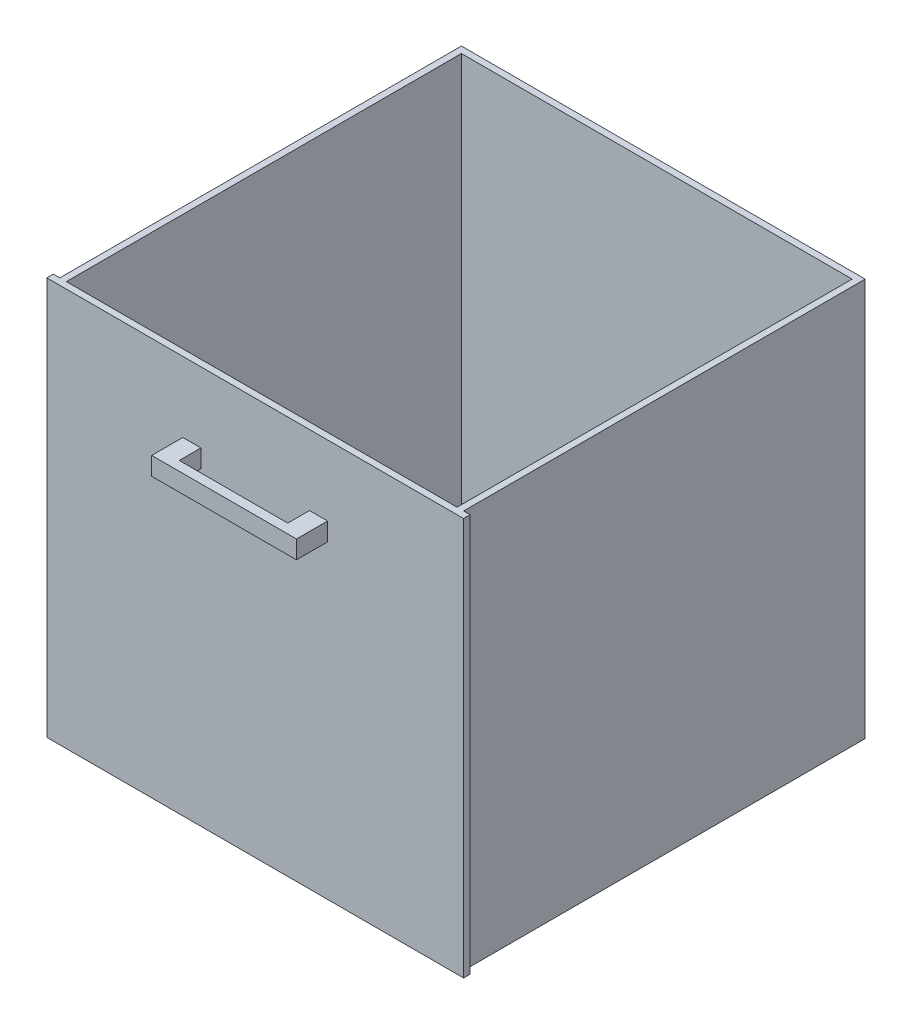
ISO-10303-21;
HEADER;
FILE_DESCRIPTION(('STEP AP214'),'2;1');
FILE_NAME('part.step','',(''),(''),'','','');
FILE_SCHEMA(('AUTOMOTIVE_DESIGN { 1 0 10303 214 1 1 1 1 }'));
ENDSEC;
DATA;
#1=APPLICATION_CONTEXT('core data for automotive mechanical design processes');
#2=APPLICATION_PROTOCOL_DEFINITION('international standard','automotive_design',2000,#1);
#3=PRODUCT_CONTEXT('',#1,'mechanical');
#4=PRODUCT('Part','Part','',(#3));
#5=PRODUCT_RELATED_PRODUCT_CATEGORY('part','',(#4));
#6=PRODUCT_DEFINITION_FORMATION('','',#4);
#7=PRODUCT_DEFINITION_CONTEXT('part definition',#1,'design');
#8=PRODUCT_DEFINITION('design','',#6,#7);
#9=PRODUCT_DEFINITION_SHAPE('','',#8);
#10=(LENGTH_UNIT() NAMED_UNIT(*) SI_UNIT(.MILLI.,.METRE.));
#11=(NAMED_UNIT(*) PLANE_ANGLE_UNIT() SI_UNIT($,.RADIAN.));
#12=(NAMED_UNIT(*) SI_UNIT($,.STERADIAN.) SOLID_ANGLE_UNIT());
#13=UNCERTAINTY_MEASURE_WITH_UNIT(LENGTH_MEASURE(1.E-05),#10,'distance_accuracy_value','');
#14=(GEOMETRIC_REPRESENTATION_CONTEXT(3) GLOBAL_UNCERTAINTY_ASSIGNED_CONTEXT((#13)) GLOBAL_UNIT_ASSIGNED_CONTEXT((#10,
#11,#12)) REPRESENTATION_CONTEXT('',''));
#15=CARTESIAN_POINT('',(0.,0.,0.));
#16=DIRECTION('',(0.,0.,1.));
#17=DIRECTION('',(1.,0.,0.));
#18=AXIS2_PLACEMENT_3D('',#15,#16,#17);
#19=CARTESIAN_POINT('',(193.87900596968,550.,280.280172413793));
#20=DIRECTION('',(0.,0.,-1.));
#21=DIRECTION('',(-1.,0.,0.));
#22=AXIS2_PLACEMENT_3D('',#19,#20,#21);
#23=PLANE('',#22);
#24=DIRECTION('',(0.,1.,0.));
#25=VECTOR('',#24,1.);
#26=CARTESIAN_POINT('',(-19.1209940303198,427.968229793754,280.280172413793));
#27=LINE('',#26,#25);
#28=CARTESIAN_POINT('',(-19.1209940303198,427.968229793754,280.280172413793));
#29=VERTEX_POINT('',#28);
#30=CARTESIAN_POINT('',(-19.1209940303198,452.968229793754,280.280172413793));
#31=VERTEX_POINT('',#30);
#32=EDGE_CURVE('E198',#29,#31,#27,.T.);
#33=ORIENTED_EDGE('',*,*,#32,.T.);
#34=DIRECTION('',(-1.,0.,0.));
#35=VECTOR('',#34,1.);
#36=CARTESIAN_POINT('',(-194.12099403032,452.968229793754,280.280172413793));
#37=LINE('',#36,#35);
#38=CARTESIAN_POINT('',(5.87900596968019,452.968229793754,280.280172413793));
#39=VERTEX_POINT('',#38);
#40=EDGE_CURVE('E214',#39,#31,#37,.T.);
#41=ORIENTED_EDGE('',*,*,#40,.F.);
#42=DIRECTION('',(0.,1.,0.));
#43=VECTOR('',#42,1.);
#44=CARTESIAN_POINT('',(5.87900596968019,452.968229793754,280.280172413793));
#45=LINE('',#44,#43);
#46=CARTESIAN_POINT('',(5.87900596968019,427.968229793754,280.280172413793));
#47=VERTEX_POINT('',#46);
#48=EDGE_CURVE('E197',#47,#39,#45,.T.);
#49=ORIENTED_EDGE('',*,*,#48,.F.);
#50=DIRECTION('',(1.,0.,0.));
#51=VECTOR('',#50,1.);
#52=CARTESIAN_POINT('',(-194.12099403032,427.968229793754,280.280172413793));
#53=LINE('',#52,#51);
#54=EDGE_CURVE('E220',#29,#47,#53,.T.);
#55=ORIENTED_EDGE('',*,*,#54,.F.);
#56=EDGE_LOOP('',(#33,#41,#49,#55));
#57=FACE_BOUND('',#56,.T.);
#58=DIRECTION('',(1.,0.,0.));
#59=VECTOR('',#58,1.);
#60=CARTESIAN_POINT('',(193.87900596968,0.,280.280172413793));
#61=LINE('',#60,#59);
#62=CARTESIAN_POINT('',(-382.12099403032,0.,280.280172413793));
#63=VERTEX_POINT('',#62);
#64=CARTESIAN_POINT('',(193.87900596968,0.,280.280172413793));
#65=VERTEX_POINT('',#64);
#66=EDGE_CURVE('E295',#63,#65,#61,.T.);
#67=ORIENTED_EDGE('',*,*,#66,.T.);
#68=DIRECTION('',(0.,-1.,0.));
#69=VECTOR('',#68,1.);
#70=CARTESIAN_POINT('',(193.87900596968,550.,280.280172413793));
#71=LINE('',#70,#69);
#72=CARTESIAN_POINT('',(193.87900596968,550.,280.280172413793));
#73=VERTEX_POINT('',#72);
#74=EDGE_CURVE('E300',#73,#65,#71,.T.);
#75=ORIENTED_EDGE('',*,*,#74,.F.);
#76=DIRECTION('',(1.,0.,0.));
#77=VECTOR('',#76,1.);
#78=CARTESIAN_POINT('',(193.87900596968,550.,280.280172413793));
#79=LINE('',#78,#77);
#80=CARTESIAN_POINT('',(-382.12099403032,550.,280.280172413793));
#81=VERTEX_POINT('',#80);
#82=EDGE_CURVE('E278',#81,#73,#79,.T.);
#83=ORIENTED_EDGE('',*,*,#82,.F.);
#84=DIRECTION('',(0.,-1.,0.));
#85=VECTOR('',#84,1.);
#86=CARTESIAN_POINT('',(-382.12099403032,550.,280.280172413793));
#87=LINE('',#86,#85);
#88=EDGE_CURVE('E303',#81,#63,#87,.T.);
#89=ORIENTED_EDGE('',*,*,#88,.T.);
#90=EDGE_LOOP('',(#67,#75,#83,#89));
#91=FACE_BOUND('',#90,.T.);
#92=CARTESIAN_POINT('',(-169.12099403032,452.968229793754,280.280172413793));
#93=VERTEX_POINT('',#92);
#94=CARTESIAN_POINT('',(-194.12099403032,452.968229793754,280.280172413793));
#95=VERTEX_POINT('',#94);
#96=EDGE_CURVE('E213',#93,#95,#37,.T.);
#97=ORIENTED_EDGE('',*,*,#96,.F.);
#98=DIRECTION('',(0.,1.,0.));
#99=VECTOR('',#98,1.);
#100=CARTESIAN_POINT('',(-169.12099403032,427.968229793754,280.280172413793));
#101=LINE('',#100,#99);
#102=CARTESIAN_POINT('',(-169.12099403032,427.968229793754,280.280172413793));
#103=VERTEX_POINT('',#102);
#104=EDGE_CURVE('E195',#103,#93,#101,.T.);
#105=ORIENTED_EDGE('',*,*,#104,.F.);
#106=CARTESIAN_POINT('',(-194.12099403032,427.968229793754,280.280172413793));
#107=VERTEX_POINT('',#106);
#108=EDGE_CURVE('E185',#107,#103,#53,.T.);
#109=ORIENTED_EDGE('',*,*,#108,.F.);
#110=DIRECTION('',(0.,-1.,0.));
#111=VECTOR('',#110,1.);
#112=CARTESIAN_POINT('',(-194.12099403032,452.968229793754,280.280172413793));
#113=LINE('',#112,#111);
#114=EDGE_CURVE('E217',#95,#107,#113,.T.);
#115=ORIENTED_EDGE('',*,*,#114,.F.);
#116=EDGE_LOOP('',(#97,#105,#109,#115));
#117=FACE_BOUND('',#116,.T.);
#118=ADVANCED_FACE('F33',(#57,#91,#117),#23,.F.);
#119=CARTESIAN_POINT('',(0.,550.,0.));
#120=DIRECTION('',(0.,-1.,0.));
#121=DIRECTION('',(0.,0.,-1.));
#122=AXIS2_PLACEMENT_3D('',#119,#120,#121);
#123=PLANE('',#122);
#124=DIRECTION('',(-1.,0.,0.));
#125=VECTOR('',#124,1.);
#126=CARTESIAN_POINT('',(184.87900596968,550.,271.280172413793));
#127=LINE('',#126,#125);
#128=CARTESIAN_POINT('',(193.87900596968,550.,271.280172413793));
#129=VERTEX_POINT('',#128);
#130=CARTESIAN_POINT('',(184.87900596968,550.,271.280172413793));
#131=VERTEX_POINT('',#130);
#132=EDGE_CURVE('E264',#129,#131,#127,.T.);
#133=ORIENTED_EDGE('',*,*,#132,.T.);
#134=DIRECTION('',(0.,0.,-1.));
#135=VECTOR('',#134,1.);
#136=CARTESIAN_POINT('',(184.87900596968,550.,-283.719827586207));
#137=LINE('',#136,#135);
#138=CARTESIAN_POINT('',(184.87900596968,550.,-283.719827586207));
#139=VERTEX_POINT('',#138);
#140=EDGE_CURVE('E267',#131,#139,#137,.T.);
#141=ORIENTED_EDGE('',*,*,#140,.T.);
#142=DIRECTION('',(-1.,0.,0.));
#143=VECTOR('',#142,1.);
#144=CARTESIAN_POINT('',(-373.12099403032,550.,-283.719827586207));
#145=LINE('',#144,#143);
#146=CARTESIAN_POINT('',(-373.12099403032,550.,-283.719827586207));
#147=VERTEX_POINT('',#146);
#148=EDGE_CURVE('E270',#139,#147,#145,.T.);
#149=ORIENTED_EDGE('',*,*,#148,.T.);
#150=DIRECTION('',(0.,0.,1.));
#151=VECTOR('',#150,1.);
#152=CARTESIAN_POINT('',(-373.12099403032,550.,-283.719827586207));
#153=LINE('',#152,#151);
#154=CARTESIAN_POINT('',(-373.12099403032,550.,271.280172413793));
#155=VERTEX_POINT('',#154);
#156=EDGE_CURVE('E272',#147,#155,#153,.T.);
#157=ORIENTED_EDGE('',*,*,#156,.T.);
#158=DIRECTION('',(-1.,0.,0.));
#159=VECTOR('',#158,1.);
#160=CARTESIAN_POINT('',(-382.12099403032,550.,271.280172413793));
#161=LINE('',#160,#159);
#162=CARTESIAN_POINT('',(-382.12099403032,550.,271.280172413793));
#163=VERTEX_POINT('',#162);
#164=EDGE_CURVE('E274',#155,#163,#161,.T.);
#165=ORIENTED_EDGE('',*,*,#164,.T.);
#166=DIRECTION('',(0.,0.,1.));
#167=VECTOR('',#166,1.);
#168=CARTESIAN_POINT('',(-382.12099403032,550.,280.280172413793));
#169=LINE('',#168,#167);
#170=EDGE_CURVE('E276',#163,#81,#169,.T.);
#171=ORIENTED_EDGE('',*,*,#170,.T.);
#172=ORIENTED_EDGE('',*,*,#82,.T.);
#173=DIRECTION('',(0.,0.,-1.));
#174=VECTOR('',#173,1.);
#175=CARTESIAN_POINT('',(193.87900596968,550.,271.280172413793));
#176=LINE('',#175,#174);
#177=EDGE_CURVE('E280',#73,#129,#176,.T.);
#178=ORIENTED_EDGE('',*,*,#177,.T.);
#179=EDGE_LOOP('',(#133,#141,#149,#157,#165,#171,#172,#178));
#180=FACE_BOUND('',#179,.T.);
#181=DIRECTION('',(0.,0.,1.));
#182=VECTOR('',#181,1.);
#183=CARTESIAN_POINT('',(175.87900596968,550.,0.));
#184=LINE('',#183,#182);
#185=CARTESIAN_POINT('',(175.87900596968,550.,-274.719827586207));
#186=VERTEX_POINT('',#185);
#187=CARTESIAN_POINT('',(175.87900596968,550.,271.280172413793));
#188=VERTEX_POINT('',#187);
#189=EDGE_CURVE('E232',#186,#188,#184,.T.);
#190=ORIENTED_EDGE('',*,*,#189,.T.);
#191=DIRECTION('',(1.,0.,0.));
#192=VECTOR('',#191,1.);
#193=CARTESIAN_POINT('',(0.,550.,271.280172413793));
#194=LINE('',#193,#192);
#195=CARTESIAN_POINT('',(-364.12099403032,550.,271.280172413793));
#196=VERTEX_POINT('',#195);
#197=EDGE_CURVE('E236',#196,#188,#194,.T.);
#198=ORIENTED_EDGE('',*,*,#197,.F.);
#199=DIRECTION('',(0.,0.,1.));
#200=VECTOR('',#199,1.);
#201=CARTESIAN_POINT('',(-364.12099403032,550.,0.));
#202=LINE('',#201,#200);
#203=CARTESIAN_POINT('',(-364.12099403032,550.,-274.719827586207));
#204=VERTEX_POINT('',#203);
#205=EDGE_CURVE('E250',#204,#196,#202,.T.);
#206=ORIENTED_EDGE('',*,*,#205,.F.);
#207=DIRECTION('',(1.,0.,0.));
#208=VECTOR('',#207,1.);
#209=CARTESIAN_POINT('',(0.,550.,-274.719827586207));
#210=LINE('',#209,#208);
#211=EDGE_CURVE('E247',#204,#186,#210,.T.);
#212=ORIENTED_EDGE('',*,*,#211,.T.);
#213=EDGE_LOOP('',(#190,#198,#206,#212));
#214=FACE_BOUND('',#213,.T.);
#215=ADVANCED_FACE('F338',(#180,#214),#123,.F.);
#216=CARTESIAN_POINT('',(184.87900596968,550.,271.280172413793));
#217=DIRECTION('',(0.,0.,1.));
#218=DIRECTION('',(1.,0.,0.));
#219=AXIS2_PLACEMENT_3D('',#216,#217,#218);
#220=PLANE('',#219);
#221=DIRECTION('',(-1.,0.,0.));
#222=VECTOR('',#221,1.);
#223=CARTESIAN_POINT('',(184.87900596968,0.,271.280172413793));
#224=LINE('',#223,#222);
#225=CARTESIAN_POINT('',(193.87900596968,0.,271.280172413793));
#226=VERTEX_POINT('',#225);
#227=CARTESIAN_POINT('',(184.87900596968,0.,271.280172413793));
#228=VERTEX_POINT('',#227);
#229=EDGE_CURVE('E257',#226,#228,#224,.T.);
#230=ORIENTED_EDGE('',*,*,#229,.T.);
#231=DIRECTION('',(0.,-1.,0.));
#232=VECTOR('',#231,1.);
#233=CARTESIAN_POINT('',(184.87900596968,550.,271.280172413793));
#234=LINE('',#233,#232);
#235=EDGE_CURVE('E11',#131,#228,#234,.T.);
#236=ORIENTED_EDGE('',*,*,#235,.F.);
#237=ORIENTED_EDGE('',*,*,#132,.F.);
#238=DIRECTION('',(0.,-1.,0.));
#239=VECTOR('',#238,1.);
#240=CARTESIAN_POINT('',(193.87900596968,550.,271.280172413793));
#241=LINE('',#240,#239);
#242=EDGE_CURVE('E282',#129,#226,#241,.T.);
#243=ORIENTED_EDGE('',*,*,#242,.T.);
#244=EDGE_LOOP('',(#230,#236,#237,#243));
#245=FACE_BOUND('',#244,.T.);
#246=ADVANCED_FACE('F35',(#245),#220,.F.);
#247=CARTESIAN_POINT('',(184.87900596968,550.,-283.719827586207));
#248=DIRECTION('',(-1.,0.,0.));
#249=DIRECTION('',(0.,0.,1.));
#250=AXIS2_PLACEMENT_3D('',#247,#248,#249);
#251=PLANE('',#250);
#252=DIRECTION('',(0.,0.,-1.));
#253=VECTOR('',#252,1.);
#254=CARTESIAN_POINT('',(184.87900596968,0.,-283.719827586207));
#255=LINE('',#254,#253);
#256=CARTESIAN_POINT('',(184.87900596968,0.,-283.719827586207));
#257=VERTEX_POINT('',#256);
#258=EDGE_CURVE('E285',#228,#257,#255,.T.);
#259=ORIENTED_EDGE('',*,*,#258,.T.);
#260=DIRECTION('',(0.,-1.,0.));
#261=VECTOR('',#260,1.);
#262=CARTESIAN_POINT('',(184.87900596968,550.,-283.719827586207));
#263=LINE('',#262,#261);
#264=EDGE_CURVE('E41',#139,#257,#263,.T.);
#265=ORIENTED_EDGE('',*,*,#264,.F.);
#266=ORIENTED_EDGE('',*,*,#140,.F.);
#267=ORIENTED_EDGE('',*,*,#235,.T.);
#268=EDGE_LOOP('',(#259,#265,#266,#267));
#269=FACE_BOUND('',#268,.T.);
#270=ADVANCED_FACE('F343',(#269),#251,.F.);
#271=CARTESIAN_POINT('',(-373.12099403032,550.,-283.719827586207));
#272=DIRECTION('',(0.,0.,1.));
#273=DIRECTION('',(1.,0.,0.));
#274=AXIS2_PLACEMENT_3D('',#271,#272,#273);
#275=PLANE('',#274);
#276=DIRECTION('',(-1.,0.,0.));
#277=VECTOR('',#276,1.);
#278=CARTESIAN_POINT('',(-373.12099403032,0.,-283.719827586207));
#279=LINE('',#278,#277);
#280=CARTESIAN_POINT('',(-373.12099403032,0.,-283.719827586207));
#281=VERTEX_POINT('',#280);
#282=EDGE_CURVE('E287',#257,#281,#279,.T.);
#283=ORIENTED_EDGE('',*,*,#282,.T.);
#284=DIRECTION('',(0.,-1.,0.));
#285=VECTOR('',#284,1.);
#286=CARTESIAN_POINT('',(-373.12099403032,550.,-283.719827586207));
#287=LINE('',#286,#285);
#288=EDGE_CURVE('E312',#147,#281,#287,.T.);
#289=ORIENTED_EDGE('',*,*,#288,.F.);
#290=ORIENTED_EDGE('',*,*,#148,.F.);
#291=ORIENTED_EDGE('',*,*,#264,.T.);
#292=EDGE_LOOP('',(#283,#289,#290,#291));
#293=FACE_BOUND('',#292,.T.);
#294=ADVANCED_FACE('F319',(#293),#275,.F.);
#295=CARTESIAN_POINT('',(-373.12099403032,550.,-283.719827586207));
#296=DIRECTION('',(1.,0.,0.));
#297=DIRECTION('',(0.,0.,-1.));
#298=AXIS2_PLACEMENT_3D('',#295,#296,#297);
#299=PLANE('',#298);
#300=DIRECTION('',(0.,0.,1.));
#301=VECTOR('',#300,1.);
#302=CARTESIAN_POINT('',(-373.12099403032,0.,-283.719827586207));
#303=LINE('',#302,#301);
#304=CARTESIAN_POINT('',(-373.12099403032,0.,271.280172413793));
#305=VERTEX_POINT('',#304);
#306=EDGE_CURVE('E289',#281,#305,#303,.T.);
#307=ORIENTED_EDGE('',*,*,#306,.T.);
#308=DIRECTION('',(0.,-1.,0.));
#309=VECTOR('',#308,1.);
#310=CARTESIAN_POINT('',(-373.12099403032,550.,271.280172413793));
#311=LINE('',#310,#309);
#312=EDGE_CURVE('E309',#155,#305,#311,.T.);
#313=ORIENTED_EDGE('',*,*,#312,.F.);
#314=ORIENTED_EDGE('',*,*,#156,.F.);
#315=ORIENTED_EDGE('',*,*,#288,.T.);
#316=EDGE_LOOP('',(#307,#313,#314,#315));
#317=FACE_BOUND('',#316,.T.);
#318=ADVANCED_FACE('F330',(#317),#299,.F.);
#319=CARTESIAN_POINT('',(-382.12099403032,550.,271.280172413793));
#320=DIRECTION('',(0.,0.,1.));
#321=DIRECTION('',(1.,0.,0.));
#322=AXIS2_PLACEMENT_3D('',#319,#320,#321);
#323=PLANE('',#322);
#324=DIRECTION('',(-1.,0.,0.));
#325=VECTOR('',#324,1.);
#326=CARTESIAN_POINT('',(-382.12099403032,0.,271.280172413793));
#327=LINE('',#326,#325);
#328=CARTESIAN_POINT('',(-382.12099403032,0.,271.280172413793));
#329=VERTEX_POINT('',#328);
#330=EDGE_CURVE('E291',#305,#329,#327,.T.);
#331=ORIENTED_EDGE('',*,*,#330,.T.);
#332=DIRECTION('',(0.,-1.,0.));
#333=VECTOR('',#332,1.);
#334=CARTESIAN_POINT('',(-382.12099403032,550.,271.280172413793));
#335=LINE('',#334,#333);
#336=EDGE_CURVE('E306',#163,#329,#335,.T.);
#337=ORIENTED_EDGE('',*,*,#336,.F.);
#338=ORIENTED_EDGE('',*,*,#164,.F.);
#339=ORIENTED_EDGE('',*,*,#312,.T.);
#340=EDGE_LOOP('',(#331,#337,#338,#339));
#341=FACE_BOUND('',#340,.T.);
#342=ADVANCED_FACE('F334',(#341),#323,.F.);
#343=CARTESIAN_POINT('',(-382.12099403032,550.,280.280172413793));
#344=DIRECTION('',(1.,0.,0.));
#345=DIRECTION('',(0.,0.,-1.));
#346=AXIS2_PLACEMENT_3D('',#343,#344,#345);
#347=PLANE('',#346);
#348=DIRECTION('',(0.,0.,1.));
#349=VECTOR('',#348,1.);
#350=CARTESIAN_POINT('',(-382.12099403032,0.,280.280172413793));
#351=LINE('',#350,#349);
#352=EDGE_CURVE('E293',#329,#63,#351,.T.);
#353=ORIENTED_EDGE('',*,*,#352,.T.);
#354=ORIENTED_EDGE('',*,*,#88,.F.);
#355=ORIENTED_EDGE('',*,*,#170,.F.);
#356=ORIENTED_EDGE('',*,*,#336,.T.);
#357=EDGE_LOOP('',(#353,#354,#355,#356));
#358=FACE_BOUND('',#357,.T.);
#359=ADVANCED_FACE('F356',(#358),#347,.F.);
#360=CARTESIAN_POINT('',(193.87900596968,550.,271.280172413793));
#361=DIRECTION('',(-1.,0.,0.));
#362=DIRECTION('',(0.,0.,1.));
#363=AXIS2_PLACEMENT_3D('',#360,#361,#362);
#364=PLANE('',#363);
#365=DIRECTION('',(0.,0.,-1.));
#366=VECTOR('',#365,1.);
#367=CARTESIAN_POINT('',(193.87900596968,0.,271.280172413793));
#368=LINE('',#367,#366);
#369=EDGE_CURVE('E268',#65,#226,#368,.T.);
#370=ORIENTED_EDGE('',*,*,#369,.T.);
#371=ORIENTED_EDGE('',*,*,#242,.F.);
#372=ORIENTED_EDGE('',*,*,#177,.F.);
#373=ORIENTED_EDGE('',*,*,#74,.T.);
#374=EDGE_LOOP('',(#370,#371,#372,#373));
#375=FACE_BOUND('',#374,.T.);
#376=ADVANCED_FACE('F349',(#375),#364,.F.);
#377=CARTESIAN_POINT('',(0.,0.,0.));
#378=DIRECTION('',(0.,-1.,0.));
#379=DIRECTION('',(0.,0.,-1.));
#380=AXIS2_PLACEMENT_3D('',#377,#378,#379);
#381=PLANE('',#380);
#382=ORIENTED_EDGE('',*,*,#229,.F.);
#383=ORIENTED_EDGE('',*,*,#369,.F.);
#384=ORIENTED_EDGE('',*,*,#66,.F.);
#385=ORIENTED_EDGE('',*,*,#352,.F.);
#386=ORIENTED_EDGE('',*,*,#330,.F.);
#387=ORIENTED_EDGE('',*,*,#306,.F.);
#388=ORIENTED_EDGE('',*,*,#282,.F.);
#389=ORIENTED_EDGE('',*,*,#258,.F.);
#390=EDGE_LOOP('',(#382,#383,#384,#385,#386,#387,#388,#389));
#391=FACE_BOUND('',#390,.T.);
#392=ADVANCED_FACE('F325',(#391),#381,.T.);
#393=CARTESIAN_POINT('',(175.87900596968,5.,0.));
#394=DIRECTION('',(-1.,0.,0.));
#395=DIRECTION('',(0.,0.,1.));
#396=AXIS2_PLACEMENT_3D('',#393,#394,#395);
#397=PLANE('',#396);
#398=ORIENTED_EDGE('',*,*,#189,.F.);
#399=DIRECTION('',(0.,1.,0.));
#400=VECTOR('',#399,1.);
#401=CARTESIAN_POINT('',(175.87900596968,5.,-274.719827586207));
#402=LINE('',#401,#400);
#403=CARTESIAN_POINT('',(175.87900596968,5.,-274.719827586207));
#404=VERTEX_POINT('',#403);
#405=EDGE_CURVE('E244',#404,#186,#402,.T.);
#406=ORIENTED_EDGE('',*,*,#405,.F.);
#407=DIRECTION('',(0.,0.,1.));
#408=VECTOR('',#407,1.);
#409=CARTESIAN_POINT('',(175.87900596968,5.,0.));
#410=LINE('',#409,#408);
#411=CARTESIAN_POINT('',(175.87900596968,5.,271.280172413793));
#412=VERTEX_POINT('',#411);
#413=EDGE_CURVE('E233',#404,#412,#410,.T.);
#414=ORIENTED_EDGE('',*,*,#413,.T.);
#415=DIRECTION('',(0.,1.,0.));
#416=VECTOR('',#415,1.);
#417=CARTESIAN_POINT('',(175.87900596968,5.,271.280172413793));
#418=LINE('',#417,#416);
#419=EDGE_CURVE('E255',#412,#188,#418,.T.);
#420=ORIENTED_EDGE('',*,*,#419,.T.);
#421=EDGE_LOOP('',(#398,#406,#414,#420));
#422=FACE_BOUND('',#421,.T.);
#423=ADVANCED_FACE('F374',(#422),#397,.T.);
#424=CARTESIAN_POINT('',(0.,5.,271.280172413793));
#425=DIRECTION('',(0.,0.,1.));
#426=DIRECTION('',(1.,0.,0.));
#427=AXIS2_PLACEMENT_3D('',#424,#425,#426);
#428=PLANE('',#427);
#429=ORIENTED_EDGE('',*,*,#197,.T.);
#430=ORIENTED_EDGE('',*,*,#419,.F.);
#431=DIRECTION('',(1.,0.,0.));
#432=VECTOR('',#431,1.);
#433=CARTESIAN_POINT('',(0.,5.,271.280172413793));
#434=LINE('',#433,#432);
#435=CARTESIAN_POINT('',(-364.12099403032,5.,271.280172413793));
#436=VERTEX_POINT('',#435);
#437=EDGE_CURVE('E241',#436,#412,#434,.T.);
#438=ORIENTED_EDGE('',*,*,#437,.F.);
#439=DIRECTION('',(0.,1.,0.));
#440=VECTOR('',#439,1.);
#441=CARTESIAN_POINT('',(-364.12099403032,5.,271.280172413793));
#442=LINE('',#441,#440);
#443=EDGE_CURVE('E258',#436,#196,#442,.T.);
#444=ORIENTED_EDGE('',*,*,#443,.T.);
#445=EDGE_LOOP('',(#429,#430,#438,#444));
#446=FACE_BOUND('',#445,.T.);
#447=ADVANCED_FACE('F378',(#446),#428,.F.);
#448=CARTESIAN_POINT('',(-364.12099403032,5.,0.));
#449=DIRECTION('',(-1.,0.,0.));
#450=DIRECTION('',(0.,0.,1.));
#451=AXIS2_PLACEMENT_3D('',#448,#449,#450);
#452=PLANE('',#451);
#453=ORIENTED_EDGE('',*,*,#205,.T.);
#454=ORIENTED_EDGE('',*,*,#443,.F.);
#455=DIRECTION('',(0.,0.,1.));
#456=VECTOR('',#455,1.);
#457=CARTESIAN_POINT('',(-364.12099403032,5.,0.));
#458=LINE('',#457,#456);
#459=CARTESIAN_POINT('',(-364.12099403032,5.,-274.719827586207));
#460=VERTEX_POINT('',#459);
#461=EDGE_CURVE('E238',#460,#436,#458,.T.);
#462=ORIENTED_EDGE('',*,*,#461,.F.);
#463=DIRECTION('',(0.,1.,0.));
#464=VECTOR('',#463,1.);
#465=CARTESIAN_POINT('',(-364.12099403032,5.,-274.719827586207));
#466=LINE('',#465,#464);
#467=EDGE_CURVE('E260',#460,#204,#466,.T.);
#468=ORIENTED_EDGE('',*,*,#467,.T.);
#469=EDGE_LOOP('',(#453,#454,#462,#468));
#470=FACE_BOUND('',#469,.T.);
#471=ADVANCED_FACE('F384',(#470),#452,.F.);
#472=CARTESIAN_POINT('',(0.,5.,-274.719827586207));
#473=DIRECTION('',(0.,0.,1.));
#474=DIRECTION('',(1.,0.,0.));
#475=AXIS2_PLACEMENT_3D('',#472,#473,#474);
#476=PLANE('',#475);
#477=ORIENTED_EDGE('',*,*,#211,.F.);
#478=ORIENTED_EDGE('',*,*,#467,.F.);
#479=DIRECTION('',(1.,0.,0.));
#480=VECTOR('',#479,1.);
#481=CARTESIAN_POINT('',(0.,5.,-274.719827586207));
#482=LINE('',#481,#480);
#483=EDGE_CURVE('E235',#460,#404,#482,.T.);
#484=ORIENTED_EDGE('',*,*,#483,.T.);
#485=ORIENTED_EDGE('',*,*,#405,.T.);
#486=EDGE_LOOP('',(#477,#478,#484,#485));
#487=FACE_BOUND('',#486,.T.);
#488=ADVANCED_FACE('F380',(#487),#476,.T.);
#489=CARTESIAN_POINT('',(0.,5.,0.));
#490=DIRECTION('',(0.,1.,0.));
#491=DIRECTION('',(0.,0.,1.));
#492=AXIS2_PLACEMENT_3D('',#489,#490,#491);
#493=PLANE('',#492);
#494=ORIENTED_EDGE('',*,*,#413,.F.);
#495=ORIENTED_EDGE('',*,*,#483,.F.);
#496=ORIENTED_EDGE('',*,*,#461,.T.);
#497=ORIENTED_EDGE('',*,*,#437,.T.);
#498=EDGE_LOOP('',(#494,#495,#496,#497));
#499=FACE_BOUND('',#498,.T.);
#500=ADVANCED_FACE('F383',(#499),#493,.T.);
#501=CARTESIAN_POINT('',(5.87900596968019,452.968229793754,323.280172413793));
#502=DIRECTION('',(-1.,0.,0.));
#503=DIRECTION('',(0.,-1.,0.));
#504=AXIS2_PLACEMENT_3D('',#501,#502,#503);
#505=PLANE('',#504);
#506=ORIENTED_EDGE('',*,*,#48,.T.);
#507=DIRECTION('',(0.,0.,-1.));
#508=VECTOR('',#507,1.);
#509=CARTESIAN_POINT('',(5.87900596968019,452.968229793754,323.280172413793));
#510=LINE('',#509,#508);
#511=CARTESIAN_POINT('',(5.87900596968019,452.968229793754,323.280172413793));
#512=VERTEX_POINT('',#511);
#513=EDGE_CURVE('E229',#512,#39,#510,.T.);
#514=ORIENTED_EDGE('',*,*,#513,.F.);
#515=DIRECTION('',(0.,1.,0.));
#516=VECTOR('',#515,1.);
#517=CARTESIAN_POINT('',(5.87900596968019,452.968229793754,323.280172413793));
#518=LINE('',#517,#516);
#519=CARTESIAN_POINT('',(5.87900596968019,427.968229793754,323.280172413793));
#520=VERTEX_POINT('',#519);
#521=EDGE_CURVE('E201',#520,#512,#518,.T.);
#522=ORIENTED_EDGE('',*,*,#521,.F.);
#523=DIRECTION('',(0.,0.,-1.));
#524=VECTOR('',#523,1.);
#525=CARTESIAN_POINT('',(5.87900596968019,427.968229793754,323.280172413793));
#526=LINE('',#525,#524);
#527=EDGE_CURVE('E210',#520,#47,#526,.T.);
#528=ORIENTED_EDGE('',*,*,#527,.T.);
#529=EDGE_LOOP('',(#506,#514,#522,#528));
#530=FACE_BOUND('',#529,.T.);
#531=ADVANCED_FACE('F394',(#530),#505,.F.);
#532=CARTESIAN_POINT('',(-194.12099403032,452.968229793754,323.280172413793));
#533=DIRECTION('',(0.,-1.,0.));
#534=DIRECTION('',(0.,0.,-1.));
#535=AXIS2_PLACEMENT_3D('',#532,#533,#534);
#536=PLANE('',#535);
#537=DIRECTION('',(1.,0.,0.));
#538=VECTOR('',#537,1.);
#539=CARTESIAN_POINT('',(-169.12099403032,452.968229793754,310.280172413793));
#540=LINE('',#539,#538);
#541=CARTESIAN_POINT('',(-169.12099403032,452.968229793754,310.280172413793));
#542=VERTEX_POINT('',#541);
#543=CARTESIAN_POINT('',(-19.1209940303198,452.968229793754,310.280172413793));
#544=VERTEX_POINT('',#543);
#545=EDGE_CURVE('E189',#542,#544,#540,.T.);
#546=ORIENTED_EDGE('',*,*,#545,.F.);
#547=DIRECTION('',(0.,0.,1.));
#548=VECTOR('',#547,1.);
#549=CARTESIAN_POINT('',(-169.12099403032,452.968229793754,280.280172413793));
#550=LINE('',#549,#548);
#551=EDGE_CURVE('E48',#93,#542,#550,.T.);
#552=ORIENTED_EDGE('',*,*,#551,.F.);
#553=ORIENTED_EDGE('',*,*,#96,.T.);
#554=DIRECTION('',(0.,0.,-1.));
#555=VECTOR('',#554,1.);
#556=CARTESIAN_POINT('',(-194.12099403032,452.968229793754,323.280172413793));
#557=LINE('',#556,#555);
#558=CARTESIAN_POINT('',(-194.12099403032,452.968229793754,323.280172413793));
#559=VERTEX_POINT('',#558);
#560=EDGE_CURVE('E226',#559,#95,#557,.T.);
#561=ORIENTED_EDGE('',*,*,#560,.F.);
#562=DIRECTION('',(-1.,0.,0.));
#563=VECTOR('',#562,1.);
#564=CARTESIAN_POINT('',(-194.12099403032,452.968229793754,323.280172413793));
#565=LINE('',#564,#563);
#566=EDGE_CURVE('E204',#512,#559,#565,.T.);
#567=ORIENTED_EDGE('',*,*,#566,.F.);
#568=ORIENTED_EDGE('',*,*,#513,.T.);
#569=ORIENTED_EDGE('',*,*,#40,.T.);
#570=DIRECTION('',(0.,0.,1.));
#571=VECTOR('',#570,1.);
#572=CARTESIAN_POINT('',(-19.1209940303198,452.968229793754,280.280172413793));
#573=LINE('',#572,#571);
#574=EDGE_CURVE('E186',#31,#544,#573,.T.);
#575=ORIENTED_EDGE('',*,*,#574,.T.);
#576=EDGE_LOOP('',(#546,#552,#553,#561,#567,#568,#569,#575));
#577=FACE_BOUND('',#576,.T.);
#578=ADVANCED_FACE('F398',(#577),#536,.F.);
#579=CARTESIAN_POINT('',(-194.12099403032,452.968229793754,323.280172413793));
#580=DIRECTION('',(1.,0.,0.));
#581=DIRECTION('',(0.,1.,0.));
#582=AXIS2_PLACEMENT_3D('',#579,#580,#581);
#583=PLANE('',#582);
#584=ORIENTED_EDGE('',*,*,#114,.T.);
#585=DIRECTION('',(0.,0.,-1.));
#586=VECTOR('',#585,1.);
#587=CARTESIAN_POINT('',(-194.12099403032,427.968229793754,323.280172413793));
#588=LINE('',#587,#586);
#589=CARTESIAN_POINT('',(-194.12099403032,427.968229793754,323.280172413793));
#590=VERTEX_POINT('',#589);
#591=EDGE_CURVE('E224',#590,#107,#588,.T.);
#592=ORIENTED_EDGE('',*,*,#591,.F.);
#593=DIRECTION('',(0.,-1.,0.));
#594=VECTOR('',#593,1.);
#595=CARTESIAN_POINT('',(-194.12099403032,452.968229793754,323.280172413793));
#596=LINE('',#595,#594);
#597=EDGE_CURVE('E206',#559,#590,#596,.T.);
#598=ORIENTED_EDGE('',*,*,#597,.F.);
#599=ORIENTED_EDGE('',*,*,#560,.T.);
#600=EDGE_LOOP('',(#584,#592,#598,#599));
#601=FACE_BOUND('',#600,.T.);
#602=ADVANCED_FACE('F402',(#601),#583,.F.);
#603=CARTESIAN_POINT('',(-194.12099403032,427.968229793754,323.280172413793));
#604=DIRECTION('',(0.,1.,0.));
#605=DIRECTION('',(0.,0.,1.));
#606=AXIS2_PLACEMENT_3D('',#603,#604,#605);
#607=PLANE('',#606);
#608=ORIENTED_EDGE('',*,*,#108,.T.);
#609=DIRECTION('',(0.,0.,1.));
#610=VECTOR('',#609,1.);
#611=CARTESIAN_POINT('',(-169.12099403032,427.968229793754,280.280172413793));
#612=LINE('',#611,#610);
#613=CARTESIAN_POINT('',(-169.12099403032,427.968229793754,310.280172413793));
#614=VERTEX_POINT('',#613);
#615=EDGE_CURVE('E172',#103,#614,#612,.T.);
#616=ORIENTED_EDGE('',*,*,#615,.T.);
#617=DIRECTION('',(1.,0.,0.));
#618=VECTOR('',#617,1.);
#619=CARTESIAN_POINT('',(-169.12099403032,427.968229793754,310.280172413793));
#620=LINE('',#619,#618);
#621=CARTESIAN_POINT('',(-19.1209940303198,427.968229793754,310.280172413793));
#622=VERTEX_POINT('',#621);
#623=EDGE_CURVE('E178',#614,#622,#620,.T.);
#624=ORIENTED_EDGE('',*,*,#623,.T.);
#625=DIRECTION('',(0.,0.,1.));
#626=VECTOR('',#625,1.);
#627=CARTESIAN_POINT('',(-19.1209940303198,427.968229793754,280.280172413793));
#628=LINE('',#627,#626);
#629=EDGE_CURVE('E175',#29,#622,#628,.T.);
#630=ORIENTED_EDGE('',*,*,#629,.F.);
#631=ORIENTED_EDGE('',*,*,#54,.T.);
#632=ORIENTED_EDGE('',*,*,#527,.F.);
#633=DIRECTION('',(1.,0.,0.));
#634=VECTOR('',#633,1.);
#635=CARTESIAN_POINT('',(-194.12099403032,427.968229793754,323.280172413793));
#636=LINE('',#635,#634);
#637=EDGE_CURVE('E208',#590,#520,#636,.T.);
#638=ORIENTED_EDGE('',*,*,#637,.F.);
#639=ORIENTED_EDGE('',*,*,#591,.T.);
#640=EDGE_LOOP('',(#608,#616,#624,#630,#631,#632,#638,#639));
#641=FACE_BOUND('',#640,.T.);
#642=ADVANCED_FACE('F183',(#641),#607,.F.);
#643=CARTESIAN_POINT('',(0.,0.,323.280172413793));
#644=DIRECTION('',(0.,0.,1.));
#645=DIRECTION('',(1.,0.,0.));
#646=AXIS2_PLACEMENT_3D('',#643,#644,#645);
#647=PLANE('',#646);
#648=ORIENTED_EDGE('',*,*,#521,.T.);
#649=ORIENTED_EDGE('',*,*,#566,.T.);
#650=ORIENTED_EDGE('',*,*,#597,.T.);
#651=ORIENTED_EDGE('',*,*,#637,.T.);
#652=EDGE_LOOP('',(#648,#649,#650,#651));
#653=FACE_BOUND('',#652,.T.);
#654=ADVANCED_FACE('F409',(#653),#647,.T.);
#655=CARTESIAN_POINT('',(-169.12099403032,427.968229793754,280.280172413793));
#656=DIRECTION('',(-1.,0.,0.));
#657=DIRECTION('',(0.,0.,1.));
#658=AXIS2_PLACEMENT_3D('',#655,#656,#657);
#659=PLANE('',#658);
#660=ORIENTED_EDGE('',*,*,#551,.T.);
#661=DIRECTION('',(0.,1.,0.));
#662=VECTOR('',#661,1.);
#663=CARTESIAN_POINT('',(-169.12099403032,427.968229793754,310.280172413793));
#664=LINE('',#663,#662);
#665=EDGE_CURVE('E169',#614,#542,#664,.T.);
#666=ORIENTED_EDGE('',*,*,#665,.F.);
#667=ORIENTED_EDGE('',*,*,#615,.F.);
#668=ORIENTED_EDGE('',*,*,#104,.T.);
#669=EDGE_LOOP('',(#660,#666,#667,#668));
#670=FACE_BOUND('',#669,.T.);
#671=ADVANCED_FACE('F170',(#670),#659,.F.);
#672=CARTESIAN_POINT('',(-19.1209940303198,427.968229793754,280.280172413793));
#673=DIRECTION('',(-1.,0.,0.));
#674=DIRECTION('',(0.,0.,1.));
#675=AXIS2_PLACEMENT_3D('',#672,#673,#674);
#676=PLANE('',#675);
#677=ORIENTED_EDGE('',*,*,#574,.F.);
#678=ORIENTED_EDGE('',*,*,#32,.F.);
#679=ORIENTED_EDGE('',*,*,#629,.T.);
#680=DIRECTION('',(0.,1.,0.));
#681=VECTOR('',#680,1.);
#682=CARTESIAN_POINT('',(-19.1209940303198,427.968229793754,310.280172413793));
#683=LINE('',#682,#681);
#684=EDGE_CURVE('E56',#622,#544,#683,.T.);
#685=ORIENTED_EDGE('',*,*,#684,.T.);
#686=EDGE_LOOP('',(#677,#678,#679,#685));
#687=FACE_BOUND('',#686,.T.);
#688=ADVANCED_FACE('F415',(#687),#676,.T.);
#689=CARTESIAN_POINT('',(-169.12099403032,427.968229793754,310.280172413793));
#690=DIRECTION('',(0.,0.,1.));
#691=DIRECTION('',(1.,0.,0.));
#692=AXIS2_PLACEMENT_3D('',#689,#690,#691);
#693=PLANE('',#692);
#694=ORIENTED_EDGE('',*,*,#545,.T.);
#695=ORIENTED_EDGE('',*,*,#684,.F.);
#696=ORIENTED_EDGE('',*,*,#623,.F.);
#697=ORIENTED_EDGE('',*,*,#665,.T.);
#698=EDGE_LOOP('',(#694,#695,#696,#697));
#699=FACE_BOUND('',#698,.T.);
#700=ADVANCED_FACE('F179',(#699),#693,.F.);
#701=CLOSED_SHELL('',(#118,#215,#246,#270,#294,#318,#342,#359,#376,#392,#423,#447,#471,#488,
#500,#531,#578,#602,#642,#654,#671,#688,#700));
#702=MANIFOLD_SOLID_BREP('B2',#701);
#703=ADVANCED_BREP_SHAPE_REPRESENTATION('',(#18,#702),#14);
#704=SHAPE_DEFINITION_REPRESENTATION(#9,#703);
ENDSEC;
END-ISO-10303-21;
